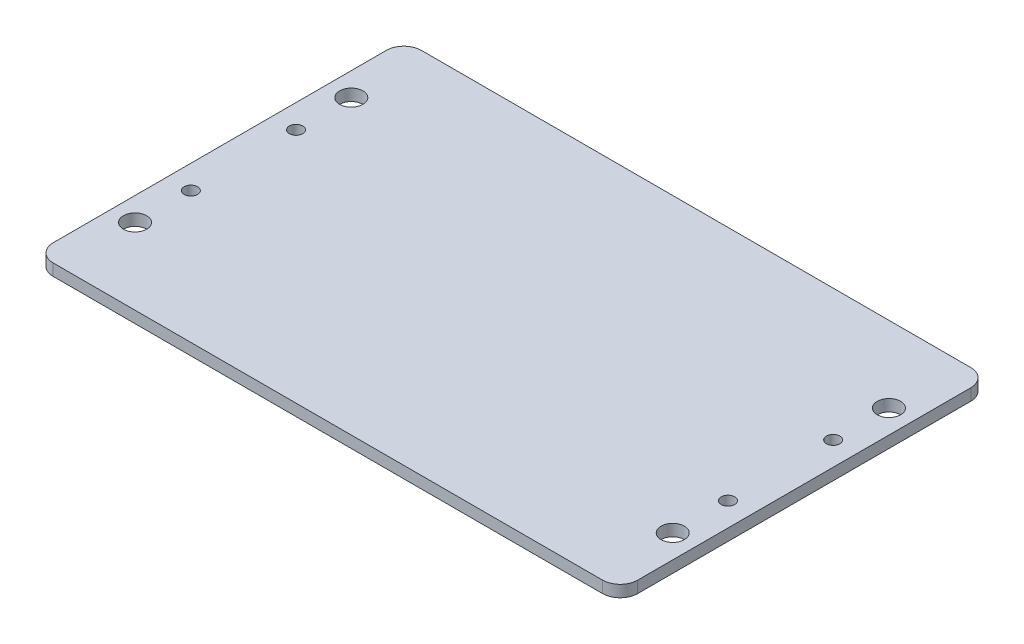
ISO-10303-21;
HEADER;
FILE_DESCRIPTION(('STEP AP214'),'2;1');
FILE_NAME('part.step','',(''),(''),'','','');
FILE_SCHEMA(('AUTOMOTIVE_DESIGN { 1 0 10303 214 1 1 1 1 }'));
ENDSEC;
DATA;
#1=APPLICATION_CONTEXT('core data for automotive mechanical design processes');
#2=APPLICATION_PROTOCOL_DEFINITION('international standard','automotive_design',2000,#1);
#3=PRODUCT_CONTEXT('',#1,'mechanical');
#4=PRODUCT('Part','Part','',(#3));
#5=PRODUCT_RELATED_PRODUCT_CATEGORY('part','',(#4));
#6=PRODUCT_DEFINITION_FORMATION('','',#4);
#7=PRODUCT_DEFINITION_CONTEXT('part definition',#1,'design');
#8=PRODUCT_DEFINITION('design','',#6,#7);
#9=PRODUCT_DEFINITION_SHAPE('','',#8);
#10=(LENGTH_UNIT() NAMED_UNIT(*) SI_UNIT(.MILLI.,.METRE.));
#11=(NAMED_UNIT(*) PLANE_ANGLE_UNIT() SI_UNIT($,.RADIAN.));
#12=(NAMED_UNIT(*) SI_UNIT($,.STERADIAN.) SOLID_ANGLE_UNIT());
#13=UNCERTAINTY_MEASURE_WITH_UNIT(LENGTH_MEASURE(1.E-05),#10,'distance_accuracy_value','');
#14=(GEOMETRIC_REPRESENTATION_CONTEXT(3) GLOBAL_UNCERTAINTY_ASSIGNED_CONTEXT((#13)) GLOBAL_UNIT_ASSIGNED_CONTEXT((#10,
#11,#12)) REPRESENTATION_CONTEXT('',''));
#15=CARTESIAN_POINT('',(0.,0.,0.));
#16=DIRECTION('',(0.,0.,1.));
#17=DIRECTION('',(1.,0.,0.));
#18=AXIS2_PLACEMENT_3D('',#15,#16,#17);
#19=CARTESIAN_POINT('',(-50.,2.,31.5));
#20=DIRECTION('',(1.,0.,0.));
#21=DIRECTION('',(0.,0.,-1.));
#22=AXIS2_PLACEMENT_3D('',#19,#20,#21);
#23=PLANE('',#22);
#24=DIRECTION('',(0.,0.,1.));
#25=VECTOR('',#24,1.);
#26=CARTESIAN_POINT('',(-50.,0.,31.5));
#27=LINE('',#26,#25);
#28=CARTESIAN_POINT('',(-50.,0.,-28.5));
#29=VERTEX_POINT('',#28);
#30=CARTESIAN_POINT('',(-50.,0.,28.5));
#31=VERTEX_POINT('',#30);
#32=EDGE_CURVE('E161',#29,#31,#27,.T.);
#33=ORIENTED_EDGE('',*,*,#32,.T.);
#34=DIRECTION('',(0.,-1.,0.));
#35=VECTOR('',#34,1.);
#36=CARTESIAN_POINT('',(-50.,2.,28.5));
#37=LINE('',#36,#35);
#38=CARTESIAN_POINT('',(-50.,2.,28.5));
#39=VERTEX_POINT('',#38);
#40=EDGE_CURVE('E11',#31,#39,#37,.F.);
#41=ORIENTED_EDGE('',*,*,#40,.T.);
#42=DIRECTION('',(0.,0.,1.));
#43=VECTOR('',#42,1.);
#44=CARTESIAN_POINT('',(-50.,2.,31.5));
#45=LINE('',#44,#43);
#46=CARTESIAN_POINT('',(-50.,2.,-28.5));
#47=VERTEX_POINT('',#46);
#48=EDGE_CURVE('E129',#47,#39,#45,.T.);
#49=ORIENTED_EDGE('',*,*,#48,.F.);
#50=DIRECTION('',(0.,-1.,0.));
#51=VECTOR('',#50,1.);
#52=CARTESIAN_POINT('',(-50.,2.,-28.5));
#53=LINE('',#52,#51);
#54=EDGE_CURVE('E45',#47,#29,#53,.T.);
#55=ORIENTED_EDGE('',*,*,#54,.T.);
#56=EDGE_LOOP('',(#33,#41,#49,#55));
#57=FACE_BOUND('',#56,.T.);
#58=ADVANCED_FACE('F37',(#57),#23,.F.);
#59=CARTESIAN_POINT('',(50.,2.,31.5));
#60=DIRECTION('',(0.,0.,-1.));
#61=DIRECTION('',(-1.,0.,0.));
#62=AXIS2_PLACEMENT_3D('',#59,#60,#61);
#63=PLANE('',#62);
#64=DIRECTION('',(1.,0.,0.));
#65=VECTOR('',#64,1.);
#66=CARTESIAN_POINT('',(50.,0.,31.5));
#67=LINE('',#66,#65);
#68=CARTESIAN_POINT('',(-47.,0.,31.5));
#69=VERTEX_POINT('',#68);
#70=CARTESIAN_POINT('',(47.,0.,31.5));
#71=VERTEX_POINT('',#70);
#72=EDGE_CURVE('E134',#69,#71,#67,.T.);
#73=ORIENTED_EDGE('',*,*,#72,.T.);
#74=DIRECTION('',(0.,-1.,0.));
#75=VECTOR('',#74,1.);
#76=CARTESIAN_POINT('',(47.,2.,31.5));
#77=LINE('',#76,#75);
#78=CARTESIAN_POINT('',(47.,2.,31.5));
#79=VERTEX_POINT('',#78);
#80=EDGE_CURVE('E52',#71,#79,#77,.F.);
#81=ORIENTED_EDGE('',*,*,#80,.T.);
#82=DIRECTION('',(1.,0.,0.));
#83=VECTOR('',#82,1.);
#84=CARTESIAN_POINT('',(50.,2.,31.5));
#85=LINE('',#84,#83);
#86=CARTESIAN_POINT('',(-47.,2.,31.5));
#87=VERTEX_POINT('',#86);
#88=EDGE_CURVE('E132',#87,#79,#85,.T.);
#89=ORIENTED_EDGE('',*,*,#88,.F.);
#90=DIRECTION('',(0.,-1.,0.));
#91=VECTOR('',#90,1.);
#92=CARTESIAN_POINT('',(-47.,2.,31.5));
#93=LINE('',#92,#91);
#94=EDGE_CURVE('E153',#87,#69,#93,.T.);
#95=ORIENTED_EDGE('',*,*,#94,.T.);
#96=EDGE_LOOP('',(#73,#81,#89,#95));
#97=FACE_BOUND('',#96,.T.);
#98=ADVANCED_FACE('F256',(#97),#63,.F.);
#99=CARTESIAN_POINT('',(50.,2.,-31.5));
#100=DIRECTION('',(-1.,0.,0.));
#101=DIRECTION('',(0.,0.,1.));
#102=AXIS2_PLACEMENT_3D('',#99,#100,#101);
#103=PLANE('',#102);
#104=DIRECTION('',(0.,0.,-1.));
#105=VECTOR('',#104,1.);
#106=CARTESIAN_POINT('',(50.,0.,-31.5));
#107=LINE('',#106,#105);
#108=CARTESIAN_POINT('',(50.,0.,28.5));
#109=VERTEX_POINT('',#108);
#110=CARTESIAN_POINT('',(50.,0.,-28.5));
#111=VERTEX_POINT('',#110);
#112=EDGE_CURVE('E130',#109,#111,#107,.T.);
#113=ORIENTED_EDGE('',*,*,#112,.T.);
#114=DIRECTION('',(0.,-1.,0.));
#115=VECTOR('',#114,1.);
#116=CARTESIAN_POINT('',(50.,2.,-28.5));
#117=LINE('',#116,#115);
#118=CARTESIAN_POINT('',(50.,2.,-28.5));
#119=VERTEX_POINT('',#118);
#120=EDGE_CURVE('E108',#111,#119,#117,.F.);
#121=ORIENTED_EDGE('',*,*,#120,.T.);
#122=DIRECTION('',(0.,0.,-1.));
#123=VECTOR('',#122,1.);
#124=CARTESIAN_POINT('',(50.,2.,-31.5));
#125=LINE('',#124,#123);
#126=CARTESIAN_POINT('',(50.,2.,28.5));
#127=VERTEX_POINT('',#126);
#128=EDGE_CURVE('E173',#127,#119,#125,.T.);
#129=ORIENTED_EDGE('',*,*,#128,.F.);
#130=DIRECTION('',(0.,-1.,0.));
#131=VECTOR('',#130,1.);
#132=CARTESIAN_POINT('',(50.,2.,28.5));
#133=LINE('',#132,#131);
#134=EDGE_CURVE('E113',#127,#109,#133,.T.);
#135=ORIENTED_EDGE('',*,*,#134,.T.);
#136=EDGE_LOOP('',(#113,#121,#129,#135));
#137=FACE_BOUND('',#136,.T.);
#138=ADVANCED_FACE('F253',(#137),#103,.F.);
#139=CARTESIAN_POINT('',(-50.,2.,-31.5));
#140=DIRECTION('',(0.,0.,1.));
#141=DIRECTION('',(1.,0.,0.));
#142=AXIS2_PLACEMENT_3D('',#139,#140,#141);
#143=PLANE('',#142);
#144=DIRECTION('',(-1.,0.,0.));
#145=VECTOR('',#144,1.);
#146=CARTESIAN_POINT('',(-50.,2.,-31.5));
#147=LINE('',#146,#145);
#148=CARTESIAN_POINT('',(47.,2.,-31.5));
#149=VERTEX_POINT('',#148);
#150=CARTESIAN_POINT('',(-47.,2.,-31.5));
#151=VERTEX_POINT('',#150);
#152=EDGE_CURVE('E123',#149,#151,#147,.T.);
#153=ORIENTED_EDGE('',*,*,#152,.F.);
#154=DIRECTION('',(0.,-1.,0.));
#155=VECTOR('',#154,1.);
#156=CARTESIAN_POINT('',(47.,2.,-31.5));
#157=LINE('',#156,#155);
#158=CARTESIAN_POINT('',(47.,0.,-31.5));
#159=VERTEX_POINT('',#158);
#160=EDGE_CURVE('E107',#149,#159,#157,.T.);
#161=ORIENTED_EDGE('',*,*,#160,.T.);
#162=DIRECTION('',(-1.,0.,0.));
#163=VECTOR('',#162,1.);
#164=CARTESIAN_POINT('',(-50.,0.,-31.5));
#165=LINE('',#164,#163);
#166=CARTESIAN_POINT('',(-47.,0.,-31.5));
#167=VERTEX_POINT('',#166);
#168=EDGE_CURVE('E120',#159,#167,#165,.T.);
#169=ORIENTED_EDGE('',*,*,#168,.T.);
#170=DIRECTION('',(0.,-1.,0.));
#171=VECTOR('',#170,1.);
#172=CARTESIAN_POINT('',(-47.,2.,-31.5));
#173=LINE('',#172,#171);
#174=EDGE_CURVE('E125',#167,#151,#173,.F.);
#175=ORIENTED_EDGE('',*,*,#174,.T.);
#176=EDGE_LOOP('',(#153,#161,#169,#175));
#177=FACE_BOUND('',#176,.T.);
#178=ADVANCED_FACE('F119',(#177),#143,.F.);
#179=CARTESIAN_POINT('',(0.,2.,0.));
#180=DIRECTION('',(0.,-1.,0.));
#181=DIRECTION('',(0.,0.,-1.));
#182=AXIS2_PLACEMENT_3D('',#179,#180,#181);
#183=PLANE('',#182);
#184=CARTESIAN_POINT('',(-45.95,2.,9.));
#185=DIRECTION('',(0.,-1.,0.));
#186=DIRECTION('',(0.,0.,1.));
#187=AXIS2_PLACEMENT_3D('',#184,#185,#186);
#188=CIRCLE('',#187,1.15);
#189=CARTESIAN_POINT('',(-45.95,2.,10.15));
#190=VERTEX_POINT('',#189);
#191=EDGE_CURVE('E204',#190,#190,#188,.T.);
#192=ORIENTED_EDGE('',*,*,#191,.T.);
#193=EDGE_LOOP('',(#192));
#194=FACE_BOUND('',#193,.T.);
#195=CARTESIAN_POINT('',(-45.95,2.,-8.99999999999999));
#196=DIRECTION('',(0.,-1.,0.));
#197=DIRECTION('',(0.,0.,-1.));
#198=AXIS2_PLACEMENT_3D('',#195,#196,#197);
#199=CIRCLE('',#198,1.15);
#200=CARTESIAN_POINT('',(-45.95,2.,-10.15));
#201=VERTEX_POINT('',#200);
#202=EDGE_CURVE('E210',#201,#201,#199,.T.);
#203=ORIENTED_EDGE('',*,*,#202,.T.);
#204=EDGE_LOOP('',(#203));
#205=FACE_BOUND('',#204,.T.);
#206=CARTESIAN_POINT('',(45.95,2.,-8.99999999999999));
#207=DIRECTION('',(0.,-1.,0.));
#208=DIRECTION('',(0.,0.,1.));
#209=AXIS2_PLACEMENT_3D('',#206,#207,#208);
#210=CIRCLE('',#209,1.15);
#211=CARTESIAN_POINT('',(45.95,2.,-7.84999999999998));
#212=VERTEX_POINT('',#211);
#213=EDGE_CURVE('E216',#212,#212,#210,.T.);
#214=ORIENTED_EDGE('',*,*,#213,.T.);
#215=EDGE_LOOP('',(#214));
#216=FACE_BOUND('',#215,.T.);
#217=CARTESIAN_POINT('',(45.95,2.,9.));
#218=DIRECTION('',(0.,-1.,0.));
#219=DIRECTION('',(0.,0.,-1.));
#220=AXIS2_PLACEMENT_3D('',#217,#218,#219);
#221=CIRCLE('',#220,1.15);
#222=CARTESIAN_POINT('',(45.95,2.,7.85));
#223=VERTEX_POINT('',#222);
#224=EDGE_CURVE('E184',#223,#223,#221,.T.);
#225=ORIENTED_EDGE('',*,*,#224,.T.);
#226=EDGE_LOOP('',(#225));
#227=FACE_BOUND('',#226,.T.);
#228=CARTESIAN_POINT('',(-46.,2.,-18.5));
#229=DIRECTION('',(0.,1.,0.));
#230=DIRECTION('',(0.,0.,-1.));
#231=AXIS2_PLACEMENT_3D('',#228,#229,#230);
#232=CIRCLE('',#231,2.);
#233=CARTESIAN_POINT('',(-46.,2.,-20.5));
#234=VERTEX_POINT('',#233);
#235=EDGE_CURVE('E180',#234,#234,#232,.T.);
#236=ORIENTED_EDGE('',*,*,#235,.F.);
#237=EDGE_LOOP('',(#236));
#238=FACE_BOUND('',#237,.T.);
#239=CARTESIAN_POINT('',(-46.,2.,18.5));
#240=DIRECTION('',(0.,1.,0.));
#241=DIRECTION('',(0.,0.,1.));
#242=AXIS2_PLACEMENT_3D('',#239,#240,#241);
#243=CIRCLE('',#242,2.);
#244=CARTESIAN_POINT('',(-46.,2.,20.5));
#245=VERTEX_POINT('',#244);
#246=EDGE_CURVE('E187',#245,#245,#243,.T.);
#247=ORIENTED_EDGE('',*,*,#246,.F.);
#248=EDGE_LOOP('',(#247));
#249=FACE_BOUND('',#248,.T.);
#250=CARTESIAN_POINT('',(46.,2.,18.5));
#251=DIRECTION('',(0.,1.,0.));
#252=DIRECTION('',(0.,0.,-1.));
#253=AXIS2_PLACEMENT_3D('',#250,#251,#252);
#254=CIRCLE('',#253,2.);
#255=CARTESIAN_POINT('',(46.,2.,16.5));
#256=VERTEX_POINT('',#255);
#257=EDGE_CURVE('E193',#256,#256,#254,.T.);
#258=ORIENTED_EDGE('',*,*,#257,.F.);
#259=EDGE_LOOP('',(#258));
#260=FACE_BOUND('',#259,.T.);
#261=CARTESIAN_POINT('',(46.,2.,-18.5));
#262=DIRECTION('',(0.,1.,0.));
#263=DIRECTION('',(0.,0.,1.));
#264=AXIS2_PLACEMENT_3D('',#261,#262,#263);
#265=CIRCLE('',#264,2.);
#266=CARTESIAN_POINT('',(46.,2.,-16.5));
#267=VERTEX_POINT('',#266);
#268=EDGE_CURVE('E169',#267,#267,#265,.T.);
#269=ORIENTED_EDGE('',*,*,#268,.F.);
#270=EDGE_LOOP('',(#269));
#271=FACE_BOUND('',#270,.T.);
#272=ORIENTED_EDGE('',*,*,#128,.T.);
#273=CARTESIAN_POINT('',(47.,2.,-28.5));
#274=DIRECTION('',(0.,-1.,0.));
#275=DIRECTION('',(0.,0.,-1.));
#276=AXIS2_PLACEMENT_3D('',#273,#274,#275);
#277=CIRCLE('',#276,3.);
#278=EDGE_CURVE('E151',#119,#149,#277,.F.);
#279=ORIENTED_EDGE('',*,*,#278,.T.);
#280=ORIENTED_EDGE('',*,*,#152,.T.);
#281=CARTESIAN_POINT('',(-47.,2.,-28.5));
#282=DIRECTION('',(0.,-1.,0.));
#283=DIRECTION('',(0.,0.,-1.));
#284=AXIS2_PLACEMENT_3D('',#281,#282,#283);
#285=CIRCLE('',#284,3.);
#286=EDGE_CURVE('E146',#151,#47,#285,.F.);
#287=ORIENTED_EDGE('',*,*,#286,.T.);
#288=ORIENTED_EDGE('',*,*,#48,.T.);
#289=CARTESIAN_POINT('',(-47.,2.,28.5));
#290=DIRECTION('',(0.,-1.,0.));
#291=DIRECTION('',(0.,0.,-1.));
#292=AXIS2_PLACEMENT_3D('',#289,#290,#291);
#293=CIRCLE('',#292,3.);
#294=EDGE_CURVE('E59',#39,#87,#293,.F.);
#295=ORIENTED_EDGE('',*,*,#294,.T.);
#296=ORIENTED_EDGE('',*,*,#88,.T.);
#297=CARTESIAN_POINT('',(47.,2.,28.5));
#298=DIRECTION('',(0.,-1.,0.));
#299=DIRECTION('',(0.,0.,-1.));
#300=AXIS2_PLACEMENT_3D('',#297,#298,#299);
#301=CIRCLE('',#300,3.);
#302=EDGE_CURVE('E149',#79,#127,#301,.F.);
#303=ORIENTED_EDGE('',*,*,#302,.T.);
#304=EDGE_LOOP('',(#272,#279,#280,#287,#288,#295,#296,#303));
#305=FACE_BOUND('',#304,.T.);
#306=ADVANCED_FACE('F227',(#194,#205,#216,#227,#238,#249,#260,#271,#305),#183,.F.);
#307=CARTESIAN_POINT('',(0.,0.,0.));
#308=DIRECTION('',(0.,-1.,0.));
#309=DIRECTION('',(0.,0.,-1.));
#310=AXIS2_PLACEMENT_3D('',#307,#308,#309);
#311=PLANE('',#310);
#312=CARTESIAN_POINT('',(-45.95,0.,9.));
#313=DIRECTION('',(0.,-1.,0.));
#314=DIRECTION('',(0.,0.,1.));
#315=AXIS2_PLACEMENT_3D('',#312,#313,#314);
#316=CIRCLE('',#315,1.15);
#317=CARTESIAN_POINT('',(-45.95,0.,10.15));
#318=VERTEX_POINT('',#317);
#319=EDGE_CURVE('E207',#318,#318,#316,.T.);
#320=ORIENTED_EDGE('',*,*,#319,.F.);
#321=EDGE_LOOP('',(#320));
#322=FACE_BOUND('',#321,.T.);
#323=CARTESIAN_POINT('',(-45.95,0.,-8.99999999999999));
#324=DIRECTION('',(0.,-1.,0.));
#325=DIRECTION('',(0.,0.,-1.));
#326=AXIS2_PLACEMENT_3D('',#323,#324,#325);
#327=CIRCLE('',#326,1.15);
#328=CARTESIAN_POINT('',(-45.95,0.,-10.15));
#329=VERTEX_POINT('',#328);
#330=EDGE_CURVE('E213',#329,#329,#327,.T.);
#331=ORIENTED_EDGE('',*,*,#330,.F.);
#332=EDGE_LOOP('',(#331));
#333=FACE_BOUND('',#332,.T.);
#334=CARTESIAN_POINT('',(45.95,0.,-8.99999999999999));
#335=DIRECTION('',(0.,-1.,0.));
#336=DIRECTION('',(0.,0.,1.));
#337=AXIS2_PLACEMENT_3D('',#334,#335,#336);
#338=CIRCLE('',#337,1.15);
#339=CARTESIAN_POINT('',(45.95,0.,-7.84999999999998));
#340=VERTEX_POINT('',#339);
#341=EDGE_CURVE('E201',#340,#340,#338,.T.);
#342=ORIENTED_EDGE('',*,*,#341,.F.);
#343=EDGE_LOOP('',(#342));
#344=FACE_BOUND('',#343,.T.);
#345=CARTESIAN_POINT('',(45.95,0.,9.));
#346=DIRECTION('',(0.,-1.,0.));
#347=DIRECTION('',(0.,0.,-1.));
#348=AXIS2_PLACEMENT_3D('',#345,#346,#347);
#349=CIRCLE('',#348,1.15);
#350=CARTESIAN_POINT('',(45.95,0.,7.85));
#351=VERTEX_POINT('',#350);
#352=EDGE_CURVE('E198',#351,#351,#349,.T.);
#353=ORIENTED_EDGE('',*,*,#352,.F.);
#354=EDGE_LOOP('',(#353));
#355=FACE_BOUND('',#354,.T.);
#356=CARTESIAN_POINT('',(-46.,0.,-18.5));
#357=DIRECTION('',(0.,1.,0.));
#358=DIRECTION('',(0.,0.,-1.));
#359=AXIS2_PLACEMENT_3D('',#356,#357,#358);
#360=CIRCLE('',#359,2.);
#361=CARTESIAN_POINT('',(-46.,0.,-20.5));
#362=VERTEX_POINT('',#361);
#363=EDGE_CURVE('E183',#362,#362,#360,.T.);
#364=ORIENTED_EDGE('',*,*,#363,.T.);
#365=EDGE_LOOP('',(#364));
#366=FACE_BOUND('',#365,.T.);
#367=CARTESIAN_POINT('',(-46.,0.,18.5));
#368=DIRECTION('',(0.,1.,0.));
#369=DIRECTION('',(0.,0.,1.));
#370=AXIS2_PLACEMENT_3D('',#367,#368,#369);
#371=CIRCLE('',#370,2.);
#372=CARTESIAN_POINT('',(-46.,0.,20.5));
#373=VERTEX_POINT('',#372);
#374=EDGE_CURVE('E190',#373,#373,#371,.T.);
#375=ORIENTED_EDGE('',*,*,#374,.T.);
#376=EDGE_LOOP('',(#375));
#377=FACE_BOUND('',#376,.T.);
#378=CARTESIAN_POINT('',(46.,0.,18.5));
#379=DIRECTION('',(0.,1.,0.));
#380=DIRECTION('',(0.,0.,-1.));
#381=AXIS2_PLACEMENT_3D('',#378,#379,#380);
#382=CIRCLE('',#381,2.);
#383=CARTESIAN_POINT('',(46.,0.,16.5));
#384=VERTEX_POINT('',#383);
#385=EDGE_CURVE('E178',#384,#384,#382,.T.);
#386=ORIENTED_EDGE('',*,*,#385,.T.);
#387=EDGE_LOOP('',(#386));
#388=FACE_BOUND('',#387,.T.);
#389=CARTESIAN_POINT('',(46.,0.,-18.5));
#390=DIRECTION('',(0.,1.,0.));
#391=DIRECTION('',(0.,0.,1.));
#392=AXIS2_PLACEMENT_3D('',#389,#390,#391);
#393=CIRCLE('',#392,2.);
#394=CARTESIAN_POINT('',(46.,0.,-16.5));
#395=VERTEX_POINT('',#394);
#396=EDGE_CURVE('E166',#395,#395,#393,.T.);
#397=ORIENTED_EDGE('',*,*,#396,.T.);
#398=EDGE_LOOP('',(#397));
#399=FACE_BOUND('',#398,.T.);
#400=ORIENTED_EDGE('',*,*,#168,.F.);
#401=CARTESIAN_POINT('',(47.,0.,-28.5));
#402=DIRECTION('',(0.,-1.,0.));
#403=DIRECTION('',(0.,0.,-1.));
#404=AXIS2_PLACEMENT_3D('',#401,#402,#403);
#405=CIRCLE('',#404,3.);
#406=EDGE_CURVE('E103',#159,#111,#405,.T.);
#407=ORIENTED_EDGE('',*,*,#406,.T.);
#408=ORIENTED_EDGE('',*,*,#112,.F.);
#409=CARTESIAN_POINT('',(47.,0.,28.5));
#410=DIRECTION('',(0.,-1.,0.));
#411=DIRECTION('',(0.,0.,-1.));
#412=AXIS2_PLACEMENT_3D('',#409,#410,#411);
#413=CIRCLE('',#412,3.);
#414=EDGE_CURVE('E114',#109,#71,#413,.T.);
#415=ORIENTED_EDGE('',*,*,#414,.T.);
#416=ORIENTED_EDGE('',*,*,#72,.F.);
#417=CARTESIAN_POINT('',(-47.,0.,28.5));
#418=DIRECTION('',(0.,-1.,0.));
#419=DIRECTION('',(0.,0.,-1.));
#420=AXIS2_PLACEMENT_3D('',#417,#418,#419);
#421=CIRCLE('',#420,3.);
#422=EDGE_CURVE('E140',#69,#31,#421,.T.);
#423=ORIENTED_EDGE('',*,*,#422,.T.);
#424=ORIENTED_EDGE('',*,*,#32,.F.);
#425=CARTESIAN_POINT('',(-47.,0.,-28.5));
#426=DIRECTION('',(0.,-1.,0.));
#427=DIRECTION('',(0.,0.,-1.));
#428=AXIS2_PLACEMENT_3D('',#425,#426,#427);
#429=CIRCLE('',#428,3.);
#430=EDGE_CURVE('E124',#29,#167,#429,.T.);
#431=ORIENTED_EDGE('',*,*,#430,.T.);
#432=EDGE_LOOP('',(#400,#407,#408,#415,#416,#423,#424,#431));
#433=FACE_BOUND('',#432,.T.);
#434=ADVANCED_FACE('F127',(#322,#333,#344,#355,#366,#377,#388,#399,#433),#311,.T.);
#435=CARTESIAN_POINT('',(46.,0.,-18.5));
#436=DIRECTION('',(0.,1.,0.));
#437=DIRECTION('',(0.,0.,1.));
#438=AXIS2_PLACEMENT_3D('',#435,#436,#437);
#439=CYLINDRICAL_SURFACE('',#438,2.);
#440=ORIENTED_EDGE('',*,*,#396,.F.);
#441=EDGE_LOOP('',(#440));
#442=FACE_BOUND('',#441,.T.);
#443=ORIENTED_EDGE('',*,*,#268,.T.);
#444=EDGE_LOOP('',(#443));
#445=FACE_BOUND('',#444,.T.);
#446=ADVANCED_FACE('F226',(#442,#445),#439,.F.);
#447=CARTESIAN_POINT('',(46.,0.,18.5));
#448=DIRECTION('',(0.,1.,0.));
#449=DIRECTION('',(0.,0.,1.));
#450=AXIS2_PLACEMENT_3D('',#447,#448,#449);
#451=CYLINDRICAL_SURFACE('',#450,2.);
#452=ORIENTED_EDGE('',*,*,#385,.F.);
#453=EDGE_LOOP('',(#452));
#454=FACE_BOUND('',#453,.T.);
#455=ORIENTED_EDGE('',*,*,#257,.T.);
#456=EDGE_LOOP('',(#455));
#457=FACE_BOUND('',#456,.T.);
#458=ADVANCED_FACE('F242',(#454,#457),#451,.F.);
#459=CARTESIAN_POINT('',(-46.,0.,18.5));
#460=DIRECTION('',(0.,1.,0.));
#461=DIRECTION('',(0.,0.,1.));
#462=AXIS2_PLACEMENT_3D('',#459,#460,#461);
#463=CYLINDRICAL_SURFACE('',#462,2.);
#464=ORIENTED_EDGE('',*,*,#374,.F.);
#465=EDGE_LOOP('',(#464));
#466=FACE_BOUND('',#465,.T.);
#467=ORIENTED_EDGE('',*,*,#246,.T.);
#468=EDGE_LOOP('',(#467));
#469=FACE_BOUND('',#468,.T.);
#470=ADVANCED_FACE('F374',(#466,#469),#463,.F.);
#471=CARTESIAN_POINT('',(-46.,0.,-18.5));
#472=DIRECTION('',(0.,1.,0.));
#473=DIRECTION('',(0.,0.,1.));
#474=AXIS2_PLACEMENT_3D('',#471,#472,#473);
#475=CYLINDRICAL_SURFACE('',#474,2.);
#476=ORIENTED_EDGE('',*,*,#363,.F.);
#477=EDGE_LOOP('',(#476));
#478=FACE_BOUND('',#477,.T.);
#479=ORIENTED_EDGE('',*,*,#235,.T.);
#480=EDGE_LOOP('',(#479));
#481=FACE_BOUND('',#480,.T.);
#482=ADVANCED_FACE('F278',(#478,#481),#475,.F.);
#483=CARTESIAN_POINT('',(47.,2.,-28.5));
#484=DIRECTION('',(0.,-1.,0.));
#485=DIRECTION('',(0.,0.,-1.));
#486=AXIS2_PLACEMENT_3D('',#483,#484,#485);
#487=CYLINDRICAL_SURFACE('',#486,3.);
#488=ORIENTED_EDGE('',*,*,#278,.F.);
#489=ORIENTED_EDGE('',*,*,#120,.F.);
#490=ORIENTED_EDGE('',*,*,#406,.F.);
#491=ORIENTED_EDGE('',*,*,#160,.F.);
#492=EDGE_LOOP('',(#488,#489,#490,#491));
#493=FACE_BOUND('',#492,.T.);
#494=ADVANCED_FACE('F106',(#493),#487,.T.);
#495=CARTESIAN_POINT('',(47.,2.,28.5));
#496=DIRECTION('',(0.,-1.,0.));
#497=DIRECTION('',(0.,0.,-1.));
#498=AXIS2_PLACEMENT_3D('',#495,#496,#497);
#499=CYLINDRICAL_SURFACE('',#498,3.);
#500=ORIENTED_EDGE('',*,*,#302,.F.);
#501=ORIENTED_EDGE('',*,*,#80,.F.);
#502=ORIENTED_EDGE('',*,*,#414,.F.);
#503=ORIENTED_EDGE('',*,*,#134,.F.);
#504=EDGE_LOOP('',(#500,#501,#502,#503));
#505=FACE_BOUND('',#504,.T.);
#506=ADVANCED_FACE('F255',(#505),#499,.T.);
#507=CARTESIAN_POINT('',(-47.,2.,28.5));
#508=DIRECTION('',(0.,-1.,0.));
#509=DIRECTION('',(0.,0.,-1.));
#510=AXIS2_PLACEMENT_3D('',#507,#508,#509);
#511=CYLINDRICAL_SURFACE('',#510,3.);
#512=ORIENTED_EDGE('',*,*,#294,.F.);
#513=ORIENTED_EDGE('',*,*,#40,.F.);
#514=ORIENTED_EDGE('',*,*,#422,.F.);
#515=ORIENTED_EDGE('',*,*,#94,.F.);
#516=EDGE_LOOP('',(#512,#513,#514,#515));
#517=FACE_BOUND('',#516,.T.);
#518=ADVANCED_FACE('F259',(#517),#511,.T.);
#519=CARTESIAN_POINT('',(-47.,2.,-28.5));
#520=DIRECTION('',(0.,-1.,0.));
#521=DIRECTION('',(0.,0.,-1.));
#522=AXIS2_PLACEMENT_3D('',#519,#520,#521);
#523=CYLINDRICAL_SURFACE('',#522,3.);
#524=ORIENTED_EDGE('',*,*,#286,.F.);
#525=ORIENTED_EDGE('',*,*,#174,.F.);
#526=ORIENTED_EDGE('',*,*,#430,.F.);
#527=ORIENTED_EDGE('',*,*,#54,.F.);
#528=EDGE_LOOP('',(#524,#525,#526,#527));
#529=FACE_BOUND('',#528,.T.);
#530=ADVANCED_FACE('F39',(#529),#523,.T.);
#531=CARTESIAN_POINT('',(45.95,2.,9.));
#532=DIRECTION('',(0.,-1.,0.));
#533=DIRECTION('',(0.,0.,-1.));
#534=AXIS2_PLACEMENT_3D('',#531,#532,#533);
#535=CYLINDRICAL_SURFACE('',#534,1.15);
#536=ORIENTED_EDGE('',*,*,#224,.F.);
#537=EDGE_LOOP('',(#536));
#538=FACE_BOUND('',#537,.T.);
#539=ORIENTED_EDGE('',*,*,#352,.T.);
#540=EDGE_LOOP('',(#539));
#541=FACE_BOUND('',#540,.T.);
#542=ADVANCED_FACE('F261',(#538,#541),#535,.F.);
#543=CARTESIAN_POINT('',(45.95,2.,-8.99999999999999));
#544=DIRECTION('',(0.,-1.,0.));
#545=DIRECTION('',(0.,0.,-1.));
#546=AXIS2_PLACEMENT_3D('',#543,#544,#545);
#547=CYLINDRICAL_SURFACE('',#546,1.15);
#548=ORIENTED_EDGE('',*,*,#213,.F.);
#549=EDGE_LOOP('',(#548));
#550=FACE_BOUND('',#549,.T.);
#551=ORIENTED_EDGE('',*,*,#341,.T.);
#552=EDGE_LOOP('',(#551));
#553=FACE_BOUND('',#552,.T.);
#554=ADVANCED_FACE('F222',(#550,#553),#547,.F.);
#555=CARTESIAN_POINT('',(-45.95,2.,-8.99999999999999));
#556=DIRECTION('',(0.,-1.,0.));
#557=DIRECTION('',(0.,0.,-1.));
#558=AXIS2_PLACEMENT_3D('',#555,#556,#557);
#559=CYLINDRICAL_SURFACE('',#558,1.15);
#560=ORIENTED_EDGE('',*,*,#202,.F.);
#561=EDGE_LOOP('',(#560));
#562=FACE_BOUND('',#561,.T.);
#563=ORIENTED_EDGE('',*,*,#330,.T.);
#564=EDGE_LOOP('',(#563));
#565=FACE_BOUND('',#564,.T.);
#566=ADVANCED_FACE('F328',(#562,#565),#559,.F.);
#567=CARTESIAN_POINT('',(-45.95,2.,9.));
#568=DIRECTION('',(0.,-1.,0.));
#569=DIRECTION('',(0.,0.,-1.));
#570=AXIS2_PLACEMENT_3D('',#567,#568,#569);
#571=CYLINDRICAL_SURFACE('',#570,1.15);
#572=ORIENTED_EDGE('',*,*,#191,.F.);
#573=EDGE_LOOP('',(#572));
#574=FACE_BOUND('',#573,.T.);
#575=ORIENTED_EDGE('',*,*,#319,.T.);
#576=EDGE_LOOP('',(#575));
#577=FACE_BOUND('',#576,.T.);
#578=ADVANCED_FACE('F339',(#574,#577),#571,.F.);
#579=CLOSED_SHELL('',(#58,#98,#138,#178,#306,#434,#446,#458,#470,#482,#494,#506,#518,#530,#542,
#554,#566,#578));
#580=MANIFOLD_SOLID_BREP('B2',#579);
#581=ADVANCED_BREP_SHAPE_REPRESENTATION('',(#18,#580),#14);
#582=SHAPE_DEFINITION_REPRESENTATION(#9,#581);
ENDSEC;
END-ISO-10303-21;
